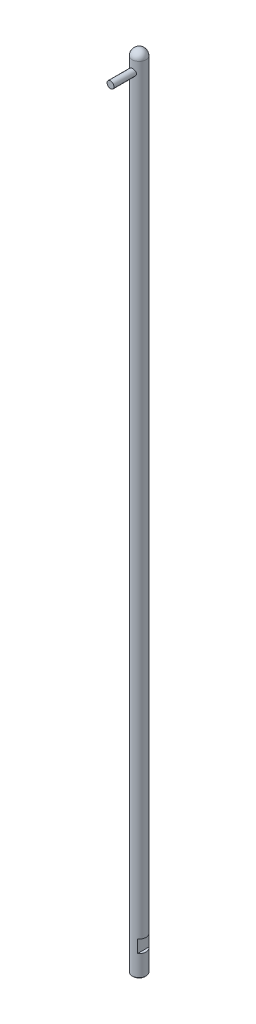
ISO-10303-21;
HEADER;
FILE_DESCRIPTION(('STEP AP214'),'2;1');
FILE_NAME('part.step','',(''),(''),'','','');
FILE_SCHEMA(('AUTOMOTIVE_DESIGN { 1 0 10303 214 1 1 1 1 }'));
ENDSEC;
DATA;
#1=APPLICATION_CONTEXT('core data for automotive mechanical design processes');
#2=APPLICATION_PROTOCOL_DEFINITION('international standard','automotive_design',2000,#1);
#3=PRODUCT_CONTEXT('',#1,'mechanical');
#4=PRODUCT('Part','Part','',(#3));
#5=PRODUCT_RELATED_PRODUCT_CATEGORY('part','',(#4));
#6=PRODUCT_DEFINITION_FORMATION('','',#4);
#7=PRODUCT_DEFINITION_CONTEXT('part definition',#1,'design');
#8=PRODUCT_DEFINITION('design','',#6,#7);
#9=PRODUCT_DEFINITION_SHAPE('','',#8);
#10=(LENGTH_UNIT() NAMED_UNIT(*) SI_UNIT(.MILLI.,.METRE.));
#11=(NAMED_UNIT(*) PLANE_ANGLE_UNIT() SI_UNIT($,.RADIAN.));
#12=(NAMED_UNIT(*) SI_UNIT($,.STERADIAN.) SOLID_ANGLE_UNIT());
#13=UNCERTAINTY_MEASURE_WITH_UNIT(LENGTH_MEASURE(1.E-05),#10,'distance_accuracy_value','');
#14=(GEOMETRIC_REPRESENTATION_CONTEXT(3) GLOBAL_UNCERTAINTY_ASSIGNED_CONTEXT((#13)) GLOBAL_UNIT_ASSIGNED_CONTEXT((#10,
#11,#12)) REPRESENTATION_CONTEXT('',''));
#15=CARTESIAN_POINT('',(0.,0.,0.));
#16=DIRECTION('',(0.,0.,1.));
#17=DIRECTION('',(1.,0.,0.));
#18=AXIS2_PLACEMENT_3D('',#15,#16,#17);
#19=CARTESIAN_POINT('',(0.,177.8,0.));
#20=DIRECTION('',(0.,-1.,0.));
#21=DIRECTION('',(0.,0.,-1.));
#22=AXIS2_PLACEMENT_3D('',#19,#20,#21);
#23=CYLINDRICAL_SURFACE('',#22,1.5367);
#24=CARTESIAN_POINT('',(0.,176.276,0.));
#25=DIRECTION('',(0.,1.,0.));
#26=DIRECTION('',(0.,0.,1.));
#27=AXIS2_PLACEMENT_3D('',#24,#25,#26);
#28=CIRCLE('',#27,1.5367);
#29=CARTESIAN_POINT('',(0.,176.276,1.5367));
#30=VERTEX_POINT('',#29);
#31=EDGE_CURVE('E11',#30,#30,#28,.F.);
#32=ORIENTED_EDGE('',*,*,#31,.T.);
#33=EDGE_LOOP('',(#32));
#34=FACE_BOUND('',#33,.T.);
#35=CARTESIAN_POINT('',(0.,0.19050000000001,0.));
#36=DIRECTION('',(0.,1.,0.));
#37=DIRECTION('',(0.,0.,1.));
#38=AXIS2_PLACEMENT_3D('',#35,#36,#37);
#39=CIRCLE('',#38,1.5367);
#40=CARTESIAN_POINT('',(0.,0.19050000000001,1.5367));
#41=VERTEX_POINT('',#40);
#42=EDGE_CURVE('E62',#41,#41,#39,.T.);
#43=ORIENTED_EDGE('',*,*,#42,.T.);
#44=EDGE_LOOP('',(#43));
#45=FACE_BOUND('',#44,.T.);
#46=DIRECTION('',(0.,-1.,0.));
#47=VECTOR('',#46,1.);
#48=CARTESIAN_POINT('',(0.9017,177.8,-1.24434078933385));
#49=LINE('',#48,#47);
#50=CARTESIAN_POINT('',(0.9017,7.62,-1.24434078933385));
#51=VERTEX_POINT('',#50);
#52=CARTESIAN_POINT('',(0.9017,4.826,-1.24434078933385));
#53=VERTEX_POINT('',#52);
#54=EDGE_CURVE('E52',#51,#53,#49,.T.);
#55=ORIENTED_EDGE('',*,*,#54,.T.);
#56=CARTESIAN_POINT('',(0.,4.826,0.));
#57=DIRECTION('',(0.,-1.,0.));
#58=DIRECTION('',(0.,0.,-1.));
#59=AXIS2_PLACEMENT_3D('',#56,#57,#58);
#60=CIRCLE('',#59,1.5367);
#61=CARTESIAN_POINT('',(0.9017,4.826,1.24434078933385));
#62=VERTEX_POINT('',#61);
#63=EDGE_CURVE('E57',#53,#62,#60,.T.);
#64=ORIENTED_EDGE('',*,*,#63,.T.);
#65=DIRECTION('',(0.,-1.,0.));
#66=VECTOR('',#65,1.);
#67=CARTESIAN_POINT('',(0.9017,177.8,1.24434078933385));
#68=LINE('',#67,#66);
#69=CARTESIAN_POINT('',(0.9017,7.62,1.24434078933385));
#70=VERTEX_POINT('',#69);
#71=EDGE_CURVE('E38',#62,#70,#68,.F.);
#72=ORIENTED_EDGE('',*,*,#71,.T.);
#73=CARTESIAN_POINT('',(0.,7.62,0.));
#74=DIRECTION('',(0.,1.,0.));
#75=DIRECTION('',(0.,0.,1.));
#76=AXIS2_PLACEMENT_3D('',#73,#74,#75);
#77=CIRCLE('',#76,1.5367);
#78=EDGE_CURVE('E45',#70,#51,#77,.T.);
#79=ORIENTED_EDGE('',*,*,#78,.T.);
#80=EDGE_LOOP('',(#55,#64,#72,#79));
#81=FACE_BOUND('',#80,.T.);
#82=CARTESIAN_POINT('',(-0.762,173.863,1.33446726823853));
#83=CARTESIAN_POINT('',(-0.76199727323124,173.823243058133,1.33447064040493));
#84=CARTESIAN_POINT('',(-0.758867850397132,173.783434767011,1.33627086991553));
#85=CARTESIAN_POINT('',(-0.746507800113871,173.705035915246,1.34321260591799));
#86=CARTESIAN_POINT('',(-0.737264140341997,173.666448140589,1.34836124906425));
#87=CARTESIAN_POINT('',(-0.713169555679689,173.591771854986,1.36125674582713));
#88=CARTESIAN_POINT('',(-0.698348052298491,173.555671386212,1.36898994312212));
#89=CARTESIAN_POINT('',(-0.663608237011816,173.486478435548,1.38616207276966));
#90=CARTESIAN_POINT('',(-0.643689722055968,173.453386073563,1.39560107307212));
#91=CARTESIAN_POINT('',(-0.597427789301388,173.388185876037,1.4160565484979));
#92=CARTESIAN_POINT('',(-0.570694490284309,173.356375202842,1.42713887204073));
#93=CARTESIAN_POINT('',(-0.512373032149905,173.297458418899,1.44910039168821));
#94=CARTESIAN_POINT('',(-0.480782499468209,173.270354622103,1.45997948555073));
#95=CARTESIAN_POINT('',(-0.411093581692107,173.219870146455,1.48116820909266));
#96=CARTESIAN_POINT('',(-0.372703218188416,173.196853471577,1.49139280600071));
#97=CARTESIAN_POINT('',(-0.291993418097754,173.157740539674,1.50926811243941));
#98=CARTESIAN_POINT('',(-0.249676441046524,173.141639985667,1.51692041948727));
#99=CARTESIAN_POINT('',(-0.165461660717001,173.11798813689,1.5283147831295));
#100=CARTESIAN_POINT('',(-0.123742836828235,173.109916181354,1.53229355940937));
#101=CARTESIAN_POINT('',(-0.0393677933711163,173.100837658624,1.53677510826149));
#102=CARTESIAN_POINT('',(0.003287854585343,173.099826896873,1.53727994445378));
#103=CARTESIAN_POINT('',(0.0844180282841774,173.10469472097,1.53487039749846));
#104=CARTESIAN_POINT('',(0.122938019420682,173.109991231624,1.53224487796882));
#105=CARTESIAN_POINT('',(0.198458622218813,173.126283894849,1.52430411704341));
#106=CARTESIAN_POINT('',(0.23545912011281,173.137280473358,1.51898867464301));
#107=CARTESIAN_POINT('',(0.30754156373931,173.164736881813,1.50606307986088));
#108=CARTESIAN_POINT('',(0.342589369910018,173.181271090334,1.49842182322602));
#109=CARTESIAN_POINT('',(0.409498590026889,173.219232888708,1.48153644189278));
#110=CARTESIAN_POINT('',(0.44135885135209,173.240662239521,1.47229174066601));
#111=CARTESIAN_POINT('',(0.504162238167532,173.290106158703,1.45205195652569));
#112=CARTESIAN_POINT('',(0.5347419627542,173.318548773024,1.44097403534054));
#113=CARTESIAN_POINT('',(0.590891709547738,173.380063842361,1.4188749817074));
#114=CARTESIAN_POINT('',(0.616457987306515,173.413139726509,1.40785389764665));
#115=CARTESIAN_POINT('',(0.663397597163072,173.485483570481,1.38638297666551));
#116=CARTESIAN_POINT('',(0.6844150056589,173.52500763376,1.37601031306051));
#117=CARTESIAN_POINT('',(0.719344206335027,173.607666078083,1.35807959523108));
#118=CARTESIAN_POINT('',(0.733263312209684,173.650796689573,1.3505186461578));
#119=CARTESIAN_POINT('',(0.752481572718363,173.735864185119,1.33989957839987));
#120=CARTESIAN_POINT('',(0.758373622742714,173.777627254217,1.33653354828219));
#121=CARTESIAN_POINT('',(0.763158122423955,173.861671232677,1.33380888401679));
#122=CARTESIAN_POINT('',(0.762055332145584,173.903951770346,1.33444752464379));
#123=CARTESIAN_POINT('',(0.753425655003604,173.983022472167,1.33933372038416));
#124=CARTESIAN_POINT('',(0.74659690705336,174.01991702952,1.34318885886087));
#125=CARTESIAN_POINT('',(0.727739616755803,174.091968724289,1.35349788139981));
#126=CARTESIAN_POINT('',(0.715709424907183,174.127125306609,1.35995258980282));
#127=CARTESIAN_POINT('',(0.686201994169066,174.196556365887,1.37508531769179));
#128=CARTESIAN_POINT('',(0.668497963953182,174.230714271372,1.38385258290349));
#129=CARTESIAN_POINT('',(0.628344223269411,174.295770795924,1.40254076714686));
#130=CARTESIAN_POINT('',(0.605892080888784,174.326667732568,1.4124622761891));
#131=CARTESIAN_POINT('',(0.553635413129434,174.388318597571,1.43381494277618));
#132=CARTESIAN_POINT('',(0.523265194571969,174.418583101529,1.44528115420725));
#133=CARTESIAN_POINT('',(0.457690945908293,174.473736344656,1.46736585685673));
#134=CARTESIAN_POINT('',(0.422485373609542,174.498623362182,1.47798407590001));
#135=CARTESIAN_POINT('',(0.347035012098346,174.542829197112,1.49752037436501));
#136=CARTESIAN_POINT('',(0.306687032050436,174.561994882787,1.50638984681257));
#137=CARTESIAN_POINT('',(0.222773498754256,174.593077387444,1.52106108044198));
#138=CARTESIAN_POINT('',(0.179210761486416,174.60500046804,1.52686549096276));
#139=CARTESIAN_POINT('',(0.094373953840674,174.620247344915,1.53433607102809));
#140=CARTESIAN_POINT('',(0.0532511235376777,174.624253531022,1.53633007829149));
#141=CARTESIAN_POINT('',(-0.0291210423496322,174.625555426911,1.53697519464951));
#142=CARTESIAN_POINT('',(-0.0703703304067982,174.622853407434,1.53562743493869));
#143=CARTESIAN_POINT('',(-0.149041738226227,174.611271591216,1.52993161500264));
#144=CARTESIAN_POINT('',(-0.186539658582078,174.602799050089,1.52578148857635));
#145=CARTESIAN_POINT('',(-0.259523180375123,174.580460001666,1.51507620359469));
#146=CARTESIAN_POINT('',(-0.295008487778962,174.566592708537,1.5085206946638));
#147=CARTESIAN_POINT('',(-0.364680208773881,174.533230260303,1.49324557396846));
#148=CARTESIAN_POINT('',(-0.398744197765616,174.513517771681,1.48444467480605));
#149=CARTESIAN_POINT('',(-0.46322336897218,174.469298808149,1.46560608337828));
#150=CARTESIAN_POINT('',(-0.493636861588436,174.444790127065,1.45556782273509));
#151=CARTESIAN_POINT('',(-0.553093773648728,174.388885604319,1.43409499629623));
#152=CARTESIAN_POINT('',(-0.581710341297012,174.35705006221,1.42262003853139));
#153=CARTESIAN_POINT('',(-0.633347571036248,174.288846818033,1.40039640367741));
#154=CARTESIAN_POINT('',(-0.656363421205901,174.252475259082,1.389648356806));
#155=CARTESIAN_POINT('',(-0.69669663751304,174.174813595575,1.36988358413279));
#156=CARTESIAN_POINT('',(-0.713828607708718,174.1334111293,1.3609263681196));
#157=CARTESIAN_POINT('',(-0.740615278285311,174.047747155393,1.34654117524892));
#158=CARTESIAN_POINT('',(-0.750295013988911,174.003495766357,1.34110139174391));
#159=CARTESIAN_POINT('',(-0.757977981436976,173.942813590027,1.33675705205276));
#160=CARTESIAN_POINT('',(-0.759483984263139,173.926903518449,1.33590128826071));
#161=CARTESIAN_POINT('',(-0.761495575242904,173.894998408307,1.33475569904555));
#162=CARTESIAN_POINT('',(-0.762001097606395,173.879003364225,1.33446591084018));
#163=CARTESIAN_POINT('',(-0.762,173.863,1.33446726823853));
#164=B_SPLINE_CURVE_WITH_KNOTS('',3,(#82,#83,#84,#85,#86,#87,#88,#89,#90,#91,#92,#93,#94,#95,
#96,#97,#98,#99,#100,#101,#102,#103,#104,#105,#106,#107,#108,#109,#110,#111,#112,#113,#114,#115,
#116,#117,#118,#119,#120,#121,#122,#123,#124,#125,#126,#127,#128,#129,#130,#131,#132,#133,#134,
#135,#136,#137,#138,#139,#140,#141,#142,#143,#144,#145,#146,#147,#148,#149,#150,#151,#152,#153,
#154,#155,#156,#157,#158,#159,#160,#161,#162,#163),.UNSPECIFIED.,.T.,.F.,(4,2,2,2,2,2,2,2,2,2,2,
2,2,2,2,2,2,2,2,2,2,2,2,2,2,2,2,2,2,2,2,2,2,2,2,2,2,2,2,2,4),(0.,0.119203506817366,
0.238661914827585,0.357498850450353,0.476340520934197,0.604813922459968,0.73335030526182,
0.870373857480363,1.00731215349668,1.13464071380472,1.26189363076176,1.37825837305356,
1.49463181199081,1.61263557131998,1.7306818479207,1.85975030384738,1.98891479442976,
2.12604681523393,2.26303725594023,2.38923129190871,2.51533946068397,2.62798937567424,
2.74067504085843,2.85858799040511,2.97656148012449,3.10911250970488,3.2417059138415,
3.37758244606062,3.5133413380182,3.63677593217767,3.76016874919428,3.87564909827963,
3.99114627527552,4.11163526607489,4.2321798107896,4.36454583221645,4.49702517907092,
4.63336118081904,4.7692371470697,4.81721698693249,4.86519998177358),.UNSPECIFIED.);
#165=CARTESIAN_POINT('',(-0.762,173.863,1.33446726823853));
#166=VERTEX_POINT('',#165);
#167=EDGE_CURVE('E68',#166,#166,#164,.T.);
#168=ORIENTED_EDGE('',*,*,#167,.F.);
#169=EDGE_LOOP('',(#168));
#170=FACE_BOUND('',#169,.T.);
#171=ADVANCED_FACE('F17',(#34,#45,#81,#170),#23,.T.);
#172=CARTESIAN_POINT('',(0.,177.8,0.));
#173=DIRECTION('',(0.,1.,0.));
#174=DIRECTION('',(0.,0.,1.));
#175=AXIS2_PLACEMENT_3D('',#172,#173,#174);
#176=PLANE('',#175);
#177=CARTESIAN_POINT('',(0.,177.8,0.));
#178=DIRECTION('',(0.,1.,0.));
#179=DIRECTION('',(0.,0.,1.));
#180=AXIS2_PLACEMENT_3D('',#177,#178,#179);
#181=CIRCLE('',#180,0.0126999999999998);
#182=CARTESIAN_POINT('',(0.,177.8,0.0126999999999998));
#183=VERTEX_POINT('',#182);
#184=EDGE_CURVE('E25',#183,#183,#181,.T.);
#185=ORIENTED_EDGE('',*,*,#184,.T.);
#186=EDGE_LOOP('',(#185));
#187=FACE_BOUND('',#186,.T.);
#188=ADVANCED_FACE('F94',(#187),#176,.T.);
#189=CARTESIAN_POINT('',(0.,0.,0.));
#190=DIRECTION('',(0.,1.,0.));
#191=DIRECTION('',(0.,0.,1.));
#192=AXIS2_PLACEMENT_3D('',#189,#190,#191);
#193=PLANE('',#192);
#194=CARTESIAN_POINT('',(0.,0.,0.));
#195=DIRECTION('',(0.,1.,0.));
#196=DIRECTION('',(0.,0.,1.));
#197=AXIS2_PLACEMENT_3D('',#194,#195,#196);
#198=CIRCLE('',#197,1.34619999999996);
#199=CARTESIAN_POINT('',(0.,0.,1.34619999999996));
#200=VERTEX_POINT('',#199);
#201=EDGE_CURVE('E65',#200,#200,#198,.F.);
#202=ORIENTED_EDGE('',*,*,#201,.T.);
#203=EDGE_LOOP('',(#202));
#204=FACE_BOUND('',#203,.T.);
#205=ADVANCED_FACE('F88',(#204),#193,.F.);
#206=CARTESIAN_POINT('',(1.5367,4.826,-1.5367));
#207=DIRECTION('',(0.,-1.,0.));
#208=DIRECTION('',(0.,0.,-1.));
#209=AXIS2_PLACEMENT_3D('',#206,#207,#208);
#210=PLANE('',#209);
#211=DIRECTION('',(0.,0.,1.));
#212=VECTOR('',#211,1.);
#213=CARTESIAN_POINT('',(0.9017,4.826,-1.5367));
#214=LINE('',#213,#212);
#215=EDGE_CURVE('E49',#53,#62,#214,.T.);
#216=ORIENTED_EDGE('',*,*,#215,.T.);
#217=ORIENTED_EDGE('',*,*,#63,.F.);
#218=EDGE_LOOP('',(#216,#217));
#219=FACE_BOUND('',#218,.T.);
#220=ADVANCED_FACE('F85',(#219),#210,.F.);
#221=CARTESIAN_POINT('',(0.9017,4.826,-1.5367));
#222=DIRECTION('',(-1.,0.,0.));
#223=DIRECTION('',(0.,-1.,0.));
#224=AXIS2_PLACEMENT_3D('',#221,#222,#223);
#225=PLANE('',#224);
#226=DIRECTION('',(0.,0.,1.));
#227=VECTOR('',#226,1.);
#228=CARTESIAN_POINT('',(0.9017,7.62,-1.5367));
#229=LINE('',#228,#227);
#230=EDGE_CURVE('E31',#51,#70,#229,.T.);
#231=ORIENTED_EDGE('',*,*,#230,.T.);
#232=ORIENTED_EDGE('',*,*,#71,.F.);
#233=ORIENTED_EDGE('',*,*,#215,.F.);
#234=ORIENTED_EDGE('',*,*,#54,.F.);
#235=EDGE_LOOP('',(#231,#232,#233,#234));
#236=FACE_BOUND('',#235,.T.);
#237=ADVANCED_FACE('F51',(#236),#225,.F.);
#238=CARTESIAN_POINT('',(1.5367,7.62,-1.5367));
#239=DIRECTION('',(0.,1.,0.));
#240=DIRECTION('',(0.,0.,1.));
#241=AXIS2_PLACEMENT_3D('',#238,#239,#240);
#242=PLANE('',#241);
#243=ORIENTED_EDGE('',*,*,#230,.F.);
#244=ORIENTED_EDGE('',*,*,#78,.F.);
#245=EDGE_LOOP('',(#243,#244));
#246=FACE_BOUND('',#245,.T.);
#247=ADVANCED_FACE('F46',(#246),#242,.F.);
#248=CARTESIAN_POINT('',(0.,0.19050000000001,0.));
#249=DIRECTION('',(0.,1.,0.));
#250=DIRECTION('',(0.,0.,1.));
#251=AXIS2_PLACEMENT_3D('',#248,#249,#250);
#252=CONICAL_SURFACE('',#251,1.5367,0.785398163397515);
#253=ORIENTED_EDGE('',*,*,#201,.F.);
#254=EDGE_LOOP('',(#253));
#255=FACE_BOUND('',#254,.T.);
#256=ORIENTED_EDGE('',*,*,#42,.F.);
#257=EDGE_LOOP('',(#256));
#258=FACE_BOUND('',#257,.T.);
#259=ADVANCED_FACE('F83',(#255,#258),#252,.T.);
#260=CARTESIAN_POINT('',(0.,173.863,6.35));
#261=DIRECTION('',(0.,0.,-1.));
#262=DIRECTION('',(-1.,0.,0.));
#263=AXIS2_PLACEMENT_3D('',#260,#261,#262);
#264=CYLINDRICAL_SURFACE('',#263,0.762);
#265=CARTESIAN_POINT('',(0.,173.863,6.35));
#266=DIRECTION('',(0.,0.,1.));
#267=DIRECTION('',(1.,0.,0.));
#268=AXIS2_PLACEMENT_3D('',#265,#266,#267);
#269=CIRCLE('',#268,0.762);
#270=CARTESIAN_POINT('',(0.762,173.863,6.35));
#271=VERTEX_POINT('',#270);
#272=EDGE_CURVE('E53',#271,#271,#269,.T.);
#273=ORIENTED_EDGE('',*,*,#272,.F.);
#274=EDGE_LOOP('',(#273));
#275=FACE_BOUND('',#274,.T.);
#276=ORIENTED_EDGE('',*,*,#167,.T.);
#277=EDGE_LOOP('',(#276));
#278=FACE_BOUND('',#277,.T.);
#279=ADVANCED_FACE('F77',(#275,#278),#264,.T.);
#280=CARTESIAN_POINT('',(0.,173.863,6.35));
#281=DIRECTION('',(0.,0.,1.));
#282=DIRECTION('',(1.,0.,0.));
#283=AXIS2_PLACEMENT_3D('',#280,#281,#282);
#284=PLANE('',#283);
#285=ORIENTED_EDGE('',*,*,#272,.T.);
#286=EDGE_LOOP('',(#285));
#287=FACE_BOUND('',#286,.T.);
#288=ADVANCED_FACE('F82',(#287),#284,.T.);
#289=CARTESIAN_POINT('',(0.,176.276,0.));
#290=DIRECTION('',(0.,1.,0.));
#291=DIRECTION('',(0.,0.,1.));
#292=AXIS2_PLACEMENT_3D('',#289,#290,#291);
#293=DEGENERATE_TOROIDAL_SURFACE('',#292,0.0126999999999998,1.524,.T.);
#294=ORIENTED_EDGE('',*,*,#31,.F.);
#295=EDGE_LOOP('',(#294));
#296=FACE_BOUND('',#295,.T.);
#297=ORIENTED_EDGE('',*,*,#184,.F.);
#298=EDGE_LOOP('',(#297));
#299=FACE_BOUND('',#298,.T.);
#300=ADVANCED_FACE('F19',(#296,#299),#293,.T.);
#301=CLOSED_SHELL('',(#171,#188,#205,#220,#237,#247,#259,#279,#288,#300));
#302=MANIFOLD_SOLID_BREP('B1',#301);
#303=ADVANCED_BREP_SHAPE_REPRESENTATION('',(#18,#302),#14);
#304=SHAPE_DEFINITION_REPRESENTATION(#9,#303);
ENDSEC;
END-ISO-10303-21;
